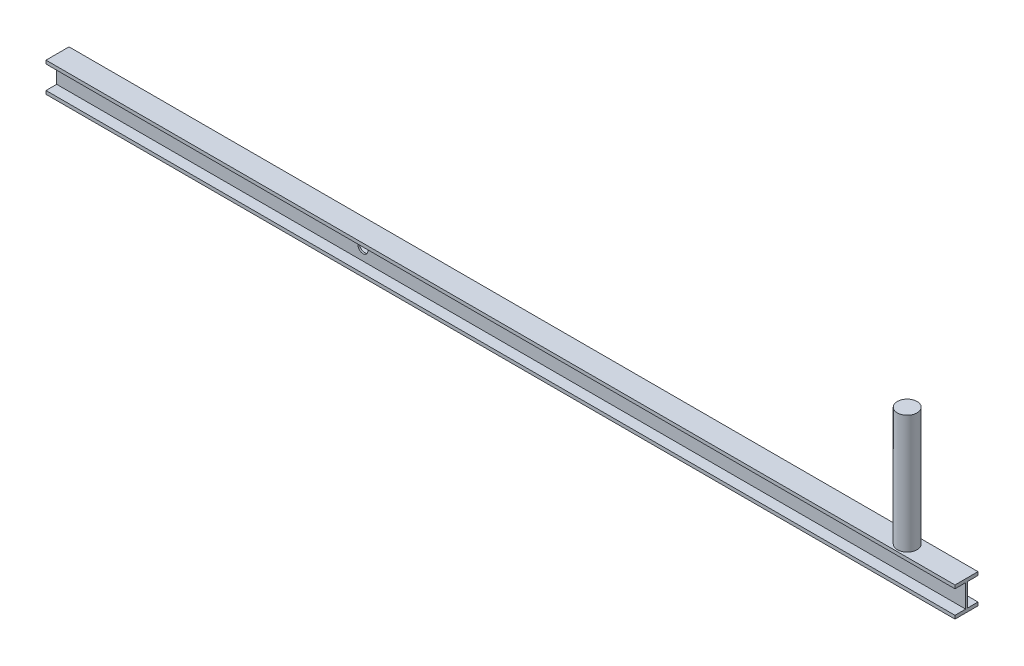
ISO-10303-21;
HEADER;
FILE_DESCRIPTION(('STEP AP214'),'2;1');
FILE_NAME('part.step','',(''),(''),'','','');
FILE_SCHEMA(('AUTOMOTIVE_DESIGN { 1 0 10303 214 1 1 1 1 }'));
ENDSEC;
DATA;
#1=APPLICATION_CONTEXT('core data for automotive mechanical design processes');
#2=APPLICATION_PROTOCOL_DEFINITION('international standard','automotive_design',2000,#1);
#3=PRODUCT_CONTEXT('',#1,'mechanical');
#4=PRODUCT('Part','Part','',(#3));
#5=PRODUCT_RELATED_PRODUCT_CATEGORY('part','',(#4));
#6=PRODUCT_DEFINITION_FORMATION('','',#4);
#7=PRODUCT_DEFINITION_CONTEXT('part definition',#1,'design');
#8=PRODUCT_DEFINITION('design','',#6,#7);
#9=PRODUCT_DEFINITION_SHAPE('','',#8);
#10=(LENGTH_UNIT() NAMED_UNIT(*) SI_UNIT(.MILLI.,.METRE.));
#11=(NAMED_UNIT(*) PLANE_ANGLE_UNIT() SI_UNIT($,.RADIAN.));
#12=(NAMED_UNIT(*) SI_UNIT($,.STERADIAN.) SOLID_ANGLE_UNIT());
#13=UNCERTAINTY_MEASURE_WITH_UNIT(LENGTH_MEASURE(1.E-05),#10,'distance_accuracy_value','');
#14=(GEOMETRIC_REPRESENTATION_CONTEXT(3) GLOBAL_UNCERTAINTY_ASSIGNED_CONTEXT((#13)) GLOBAL_UNIT_ASSIGNED_CONTEXT((#10,
#11,#12)) REPRESENTATION_CONTEXT('',''));
#15=CARTESIAN_POINT('',(0.,0.,0.));
#16=DIRECTION('',(0.,0.,1.));
#17=DIRECTION('',(1.,0.,0.));
#18=AXIS2_PLACEMENT_3D('',#15,#16,#17);
#19=CARTESIAN_POINT('',(2336.8,0.,0.));
#20=DIRECTION('',(0.,0.,-1.));
#21=DIRECTION('',(0.,1.,0.));
#22=AXIS2_PLACEMENT_3D('',#19,#20,#21);
#23=PLANE('',#22);
#24=DIRECTION('',(0.,-1.,0.));
#25=VECTOR('',#24,1.);
#26=CARTESIAN_POINT('',(0.,0.,0.));
#27=LINE('',#26,#25);
#28=CARTESIAN_POINT('',(0.,8.63599999999999,0.));
#29=VERTEX_POINT('',#28);
#30=CARTESIAN_POINT('',(0.,0.,0.));
#31=VERTEX_POINT('',#30);
#32=EDGE_CURVE('E154',#29,#31,#27,.T.);
#33=ORIENTED_EDGE('',*,*,#32,.T.);
#34=DIRECTION('',(-1.,0.,0.));
#35=VECTOR('',#34,1.);
#36=CARTESIAN_POINT('',(2336.8,0.,0.));
#37=LINE('',#36,#35);
#38=CARTESIAN_POINT('',(2336.8,0.,0.));
#39=VERTEX_POINT('',#38);
#40=EDGE_CURVE('E41',#39,#31,#37,.T.);
#41=ORIENTED_EDGE('',*,*,#40,.F.);
#42=DIRECTION('',(0.,-1.,0.));
#43=VECTOR('',#42,1.);
#44=CARTESIAN_POINT('',(2336.8,0.,0.));
#45=LINE('',#44,#43);
#46=CARTESIAN_POINT('',(2336.8,8.63599999999999,0.));
#47=VERTEX_POINT('',#46);
#48=EDGE_CURVE('E177',#47,#39,#45,.T.);
#49=ORIENTED_EDGE('',*,*,#48,.F.);
#50=DIRECTION('',(-1.,0.,0.));
#51=VECTOR('',#50,1.);
#52=CARTESIAN_POINT('',(2336.8,8.63599999999999,0.));
#53=LINE('',#52,#51);
#54=EDGE_CURVE('E150',#47,#29,#53,.T.);
#55=ORIENTED_EDGE('',*,*,#54,.T.);
#56=EDGE_LOOP('',(#33,#41,#49,#55));
#57=FACE_BOUND('',#56,.T.);
#58=ADVANCED_FACE('F32',(#57),#23,.F.);
#59=CARTESIAN_POINT('',(2336.8,0.,0.));
#60=DIRECTION('',(0.,1.,0.));
#61=DIRECTION('',(0.,0.,1.));
#62=AXIS2_PLACEMENT_3D('',#59,#60,#61);
#63=PLANE('',#62);
#64=DIRECTION('',(0.,0.,-1.));
#65=VECTOR('',#64,1.);
#66=CARTESIAN_POINT('',(0.,0.,0.));
#67=LINE('',#66,#65);
#68=CARTESIAN_POINT('',(0.,0.,-59.182));
#69=VERTEX_POINT('',#68);
#70=EDGE_CURVE('E157',#31,#69,#67,.T.);
#71=ORIENTED_EDGE('',*,*,#70,.T.);
#72=DIRECTION('',(-1.,0.,0.));
#73=VECTOR('',#72,1.);
#74=CARTESIAN_POINT('',(2336.8,0.,-59.182));
#75=LINE('',#74,#73);
#76=CARTESIAN_POINT('',(2336.8,0.,-59.182));
#77=VERTEX_POINT('',#76);
#78=EDGE_CURVE('E199',#77,#69,#75,.T.);
#79=ORIENTED_EDGE('',*,*,#78,.F.);
#80=DIRECTION('',(0.,0.,-1.));
#81=VECTOR('',#80,1.);
#82=CARTESIAN_POINT('',(2336.8,0.,0.));
#83=LINE('',#82,#81);
#84=EDGE_CURVE('E105',#39,#77,#83,.T.);
#85=ORIENTED_EDGE('',*,*,#84,.F.);
#86=ORIENTED_EDGE('',*,*,#40,.T.);
#87=EDGE_LOOP('',(#71,#79,#85,#86));
#88=FACE_BOUND('',#87,.T.);
#89=ADVANCED_FACE('F203',(#88),#63,.F.);
#90=CARTESIAN_POINT('',(2336.8,0.,-59.182));
#91=DIRECTION('',(0.,0.,1.));
#92=DIRECTION('',(0.,-1.,0.));
#93=AXIS2_PLACEMENT_3D('',#90,#91,#92);
#94=PLANE('',#93);
#95=DIRECTION('',(0.,1.,0.));
#96=VECTOR('',#95,1.);
#97=CARTESIAN_POINT('',(0.,0.,-59.182));
#98=LINE('',#97,#96);
#99=CARTESIAN_POINT('',(0.,8.636,-59.182));
#100=VERTEX_POINT('',#99);
#101=EDGE_CURVE('E160',#69,#100,#98,.T.);
#102=ORIENTED_EDGE('',*,*,#101,.T.);
#103=DIRECTION('',(-1.,0.,0.));
#104=VECTOR('',#103,1.);
#105=CARTESIAN_POINT('',(2336.8,8.636,-59.182));
#106=LINE('',#105,#104);
#107=CARTESIAN_POINT('',(2336.8,8.636,-59.182));
#108=VERTEX_POINT('',#107);
#109=EDGE_CURVE('E196',#108,#100,#106,.T.);
#110=ORIENTED_EDGE('',*,*,#109,.F.);
#111=DIRECTION('',(0.,1.,0.));
#112=VECTOR('',#111,1.);
#113=CARTESIAN_POINT('',(2336.8,0.,-59.182));
#114=LINE('',#113,#112);
#115=EDGE_CURVE('E223',#77,#108,#114,.T.);
#116=ORIENTED_EDGE('',*,*,#115,.F.);
#117=ORIENTED_EDGE('',*,*,#78,.T.);
#118=EDGE_LOOP('',(#102,#110,#116,#117));
#119=FACE_BOUND('',#118,.T.);
#120=ADVANCED_FACE('F214',(#119),#94,.F.);
#121=CARTESIAN_POINT('',(2336.8,8.636,-59.182));
#122=DIRECTION('',(0.,-1.,0.));
#123=DIRECTION('',(0.,0.,-1.));
#124=AXIS2_PLACEMENT_3D('',#121,#122,#123);
#125=PLANE('',#124);
#126=DIRECTION('',(0.,0.,1.));
#127=VECTOR('',#126,1.);
#128=CARTESIAN_POINT('',(0.,8.636,-59.182));
#129=LINE('',#128,#127);
#130=CARTESIAN_POINT('',(0.,8.636,-31.75));
#131=VERTEX_POINT('',#130);
#132=EDGE_CURVE('E162',#100,#131,#129,.T.);
#133=ORIENTED_EDGE('',*,*,#132,.T.);
#134=DIRECTION('',(-1.,0.,0.));
#135=VECTOR('',#134,1.);
#136=CARTESIAN_POINT('',(2336.8,8.636,-31.75));
#137=LINE('',#136,#135);
#138=CARTESIAN_POINT('',(2336.8,8.636,-31.75));
#139=VERTEX_POINT('',#138);
#140=EDGE_CURVE('E193',#139,#131,#137,.T.);
#141=ORIENTED_EDGE('',*,*,#140,.F.);
#142=DIRECTION('',(0.,0.,1.));
#143=VECTOR('',#142,1.);
#144=CARTESIAN_POINT('',(2336.8,8.636,-59.182));
#145=LINE('',#144,#143);
#146=EDGE_CURVE('E220',#108,#139,#145,.T.);
#147=ORIENTED_EDGE('',*,*,#146,.F.);
#148=ORIENTED_EDGE('',*,*,#109,.T.);
#149=EDGE_LOOP('',(#133,#141,#147,#148));
#150=FACE_BOUND('',#149,.T.);
#151=ADVANCED_FACE('F218',(#150),#125,.F.);
#152=CARTESIAN_POINT('',(2336.8,67.564,-31.75));
#153=DIRECTION('',(0.,0.,1.));
#154=DIRECTION('',(1.,0.,0.));
#155=AXIS2_PLACEMENT_3D('',#152,#153,#154);
#156=PLANE('',#155);
#157=CARTESIAN_POINT('',(787.4,38.1,-31.75));
#158=DIRECTION('',(0.,0.,1.));
#159=DIRECTION('',(1.,0.,0.));
#160=AXIS2_PLACEMENT_3D('',#157,#158,#159);
#161=CIRCLE('',#160,12.7);
#162=CARTESIAN_POINT('',(800.1,38.1,-31.75));
#163=VERTEX_POINT('',#162);
#164=EDGE_CURVE('E380',#163,#163,#161,.T.);
#165=ORIENTED_EDGE('',*,*,#164,.T.);
#166=EDGE_LOOP('',(#165));
#167=FACE_BOUND('',#166,.T.);
#168=DIRECTION('',(0.,1.,0.));
#169=VECTOR('',#168,1.);
#170=CARTESIAN_POINT('',(0.,67.564,-31.75));
#171=LINE('',#170,#169);
#172=CARTESIAN_POINT('',(0.,67.564,-31.75));
#173=VERTEX_POINT('',#172);
#174=EDGE_CURVE('E164',#131,#173,#171,.T.);
#175=ORIENTED_EDGE('',*,*,#174,.T.);
#176=DIRECTION('',(-1.,0.,0.));
#177=VECTOR('',#176,1.);
#178=CARTESIAN_POINT('',(2336.8,67.564,-31.75));
#179=LINE('',#178,#177);
#180=CARTESIAN_POINT('',(2336.8,67.564,-31.75));
#181=VERTEX_POINT('',#180);
#182=EDGE_CURVE('E190',#181,#173,#179,.T.);
#183=ORIENTED_EDGE('',*,*,#182,.F.);
#184=DIRECTION('',(0.,1.,0.));
#185=VECTOR('',#184,1.);
#186=CARTESIAN_POINT('',(2336.8,67.564,-31.75));
#187=LINE('',#186,#185);
#188=EDGE_CURVE('E222',#139,#181,#187,.T.);
#189=ORIENTED_EDGE('',*,*,#188,.F.);
#190=ORIENTED_EDGE('',*,*,#140,.T.);
#191=EDGE_LOOP('',(#175,#183,#189,#190));
#192=FACE_BOUND('',#191,.T.);
#193=ADVANCED_FACE('F254',(#167,#192),#156,.F.);
#194=CARTESIAN_POINT('',(2336.8,67.564,-59.182));
#195=DIRECTION('',(0.,1.,0.));
#196=DIRECTION('',(0.,0.,1.));
#197=AXIS2_PLACEMENT_3D('',#194,#195,#196);
#198=PLANE('',#197);
#199=DIRECTION('',(0.,0.,-1.));
#200=VECTOR('',#199,1.);
#201=CARTESIAN_POINT('',(0.,67.564,-59.182));
#202=LINE('',#201,#200);
#203=CARTESIAN_POINT('',(0.,67.564,-59.182));
#204=VERTEX_POINT('',#203);
#205=EDGE_CURVE('E166',#173,#204,#202,.T.);
#206=ORIENTED_EDGE('',*,*,#205,.T.);
#207=DIRECTION('',(-1.,0.,0.));
#208=VECTOR('',#207,1.);
#209=CARTESIAN_POINT('',(2336.8,67.564,-59.182));
#210=LINE('',#209,#208);
#211=CARTESIAN_POINT('',(2336.8,67.564,-59.182));
#212=VERTEX_POINT('',#211);
#213=EDGE_CURVE('E187',#212,#204,#210,.T.);
#214=ORIENTED_EDGE('',*,*,#213,.F.);
#215=DIRECTION('',(0.,0.,-1.));
#216=VECTOR('',#215,1.);
#217=CARTESIAN_POINT('',(2336.8,67.564,-59.182));
#218=LINE('',#217,#216);
#219=EDGE_CURVE('E225',#181,#212,#218,.T.);
#220=ORIENTED_EDGE('',*,*,#219,.F.);
#221=ORIENTED_EDGE('',*,*,#182,.T.);
#222=EDGE_LOOP('',(#206,#214,#220,#221));
#223=FACE_BOUND('',#222,.T.);
#224=ADVANCED_FACE('F251',(#223),#198,.F.);
#225=CARTESIAN_POINT('',(2336.8,67.564,-59.182));
#226=DIRECTION('',(0.,0.,1.));
#227=DIRECTION('',(1.,0.,0.));
#228=AXIS2_PLACEMENT_3D('',#225,#226,#227);
#229=PLANE('',#228);
#230=DIRECTION('',(0.,1.,0.));
#231=VECTOR('',#230,1.);
#232=CARTESIAN_POINT('',(0.,67.564,-59.182));
#233=LINE('',#232,#231);
#234=CARTESIAN_POINT('',(0.,76.2,-59.182));
#235=VERTEX_POINT('',#234);
#236=EDGE_CURVE('E168',#204,#235,#233,.T.);
#237=ORIENTED_EDGE('',*,*,#236,.T.);
#238=DIRECTION('',(-1.,0.,0.));
#239=VECTOR('',#238,1.);
#240=CARTESIAN_POINT('',(2336.8,76.2,-59.182));
#241=LINE('',#240,#239);
#242=CARTESIAN_POINT('',(2336.8,76.2,-59.182));
#243=VERTEX_POINT('',#242);
#244=EDGE_CURVE('E184',#243,#235,#241,.T.);
#245=ORIENTED_EDGE('',*,*,#244,.F.);
#246=DIRECTION('',(0.,1.,0.));
#247=VECTOR('',#246,1.);
#248=CARTESIAN_POINT('',(2336.8,67.564,-59.182));
#249=LINE('',#248,#247);
#250=EDGE_CURVE('E231',#212,#243,#249,.T.);
#251=ORIENTED_EDGE('',*,*,#250,.F.);
#252=ORIENTED_EDGE('',*,*,#213,.T.);
#253=EDGE_LOOP('',(#237,#245,#251,#252));
#254=FACE_BOUND('',#253,.T.);
#255=ADVANCED_FACE('F247',(#254),#229,.F.);
#256=CARTESIAN_POINT('',(2336.8,76.2,0.));
#257=DIRECTION('',(0.,-1.,0.));
#258=DIRECTION('',(0.,0.,-1.));
#259=AXIS2_PLACEMENT_3D('',#256,#257,#258);
#260=PLANE('',#259);
#261=CARTESIAN_POINT('',(2184.4,76.2,-29.591));
#262=DIRECTION('',(0.,-1.,0.));
#263=DIRECTION('',(0.,0.,-1.));
#264=AXIS2_PLACEMENT_3D('',#261,#262,#263);
#265=CIRCLE('',#264,25.3999999999998);
#266=CARTESIAN_POINT('',(2184.4,76.2,-54.9909999999998));
#267=VERTEX_POINT('',#266);
#268=EDGE_CURVE('E11',#267,#267,#265,.F.);
#269=ORIENTED_EDGE('',*,*,#268,.F.);
#270=EDGE_LOOP('',(#269));
#271=FACE_BOUND('',#270,.T.);
#272=DIRECTION('',(0.,0.,1.));
#273=VECTOR('',#272,1.);
#274=CARTESIAN_POINT('',(0.,76.2,0.));
#275=LINE('',#274,#273);
#276=CARTESIAN_POINT('',(0.,76.2,0.));
#277=VERTEX_POINT('',#276);
#278=EDGE_CURVE('E170',#235,#277,#275,.T.);
#279=ORIENTED_EDGE('',*,*,#278,.T.);
#280=DIRECTION('',(-1.,0.,0.));
#281=VECTOR('',#280,1.);
#282=CARTESIAN_POINT('',(2336.8,76.2,0.));
#283=LINE('',#282,#281);
#284=CARTESIAN_POINT('',(2336.8,76.2,0.));
#285=VERTEX_POINT('',#284);
#286=EDGE_CURVE('E181',#285,#277,#283,.T.);
#287=ORIENTED_EDGE('',*,*,#286,.F.);
#288=DIRECTION('',(0.,0.,1.));
#289=VECTOR('',#288,1.);
#290=CARTESIAN_POINT('',(2336.8,76.2,0.));
#291=LINE('',#290,#289);
#292=EDGE_CURVE('E233',#243,#285,#291,.T.);
#293=ORIENTED_EDGE('',*,*,#292,.F.);
#294=ORIENTED_EDGE('',*,*,#244,.T.);
#295=EDGE_LOOP('',(#279,#287,#293,#294));
#296=FACE_BOUND('',#295,.T.);
#297=ADVANCED_FACE('F239',(#271,#296),#260,.F.);
#298=CARTESIAN_POINT('',(2336.8,67.564,0.));
#299=DIRECTION('',(0.,0.,-1.));
#300=DIRECTION('',(0.,1.,0.));
#301=AXIS2_PLACEMENT_3D('',#298,#299,#300);
#302=PLANE('',#301);
#303=DIRECTION('',(0.,-1.,0.));
#304=VECTOR('',#303,1.);
#305=CARTESIAN_POINT('',(0.,67.564,0.));
#306=LINE('',#305,#304);
#307=CARTESIAN_POINT('',(0.,67.564,0.));
#308=VERTEX_POINT('',#307);
#309=EDGE_CURVE('E172',#277,#308,#306,.T.);
#310=ORIENTED_EDGE('',*,*,#309,.T.);
#311=DIRECTION('',(-1.,0.,0.));
#312=VECTOR('',#311,1.);
#313=CARTESIAN_POINT('',(2336.8,67.564,0.));
#314=LINE('',#313,#312);
#315=CARTESIAN_POINT('',(2336.8,67.564,0.));
#316=VERTEX_POINT('',#315);
#317=EDGE_CURVE('E145',#316,#308,#314,.T.);
#318=ORIENTED_EDGE('',*,*,#317,.F.);
#319=DIRECTION('',(0.,-1.,0.));
#320=VECTOR('',#319,1.);
#321=CARTESIAN_POINT('',(2336.8,67.564,0.));
#322=LINE('',#321,#320);
#323=EDGE_CURVE('E136',#285,#316,#322,.T.);
#324=ORIENTED_EDGE('',*,*,#323,.F.);
#325=ORIENTED_EDGE('',*,*,#286,.T.);
#326=EDGE_LOOP('',(#310,#318,#324,#325));
#327=FACE_BOUND('',#326,.T.);
#328=ADVANCED_FACE('F243',(#327),#302,.F.);
#329=CARTESIAN_POINT('',(2336.8,67.564,0.));
#330=DIRECTION('',(0.,1.,0.));
#331=DIRECTION('',(0.,0.,1.));
#332=AXIS2_PLACEMENT_3D('',#329,#330,#331);
#333=PLANE('',#332);
#334=DIRECTION('',(0.,0.,-1.));
#335=VECTOR('',#334,1.);
#336=CARTESIAN_POINT('',(0.,67.564,0.));
#337=LINE('',#336,#335);
#338=CARTESIAN_POINT('',(0.,67.564,-27.432));
#339=VERTEX_POINT('',#338);
#340=EDGE_CURVE('E144',#308,#339,#337,.T.);
#341=ORIENTED_EDGE('',*,*,#340,.T.);
#342=DIRECTION('',(-1.,0.,0.));
#343=VECTOR('',#342,1.);
#344=CARTESIAN_POINT('',(2336.8,67.564,-27.432));
#345=LINE('',#344,#343);
#346=CARTESIAN_POINT('',(2336.8,67.564,-27.432));
#347=VERTEX_POINT('',#346);
#348=EDGE_CURVE('E141',#347,#339,#345,.T.);
#349=ORIENTED_EDGE('',*,*,#348,.F.);
#350=DIRECTION('',(0.,0.,-1.));
#351=VECTOR('',#350,1.);
#352=CARTESIAN_POINT('',(2336.8,67.564,0.));
#353=LINE('',#352,#351);
#354=EDGE_CURVE('E130',#316,#347,#353,.T.);
#355=ORIENTED_EDGE('',*,*,#354,.F.);
#356=ORIENTED_EDGE('',*,*,#317,.T.);
#357=EDGE_LOOP('',(#341,#349,#355,#356));
#358=FACE_BOUND('',#357,.T.);
#359=ADVANCED_FACE('F142',(#358),#333,.F.);
#360=CARTESIAN_POINT('',(2336.8,67.564,-27.432));
#361=DIRECTION('',(0.,0.,-1.));
#362=DIRECTION('',(-1.,0.,0.));
#363=AXIS2_PLACEMENT_3D('',#360,#361,#362);
#364=PLANE('',#363);
#365=CARTESIAN_POINT('',(787.4,38.1,-27.432));
#366=DIRECTION('',(0.,0.,-1.));
#367=DIRECTION('',(-1.,0.,0.));
#368=AXIS2_PLACEMENT_3D('',#365,#366,#367);
#369=CIRCLE('',#368,12.7);
#370=CARTESIAN_POINT('',(774.7,38.1,-27.432));
#371=VERTEX_POINT('',#370);
#372=EDGE_CURVE('E35',#371,#371,#369,.F.);
#373=ORIENTED_EDGE('',*,*,#372,.F.);
#374=EDGE_LOOP('',(#373));
#375=FACE_BOUND('',#374,.T.);
#376=DIRECTION('',(0.,-1.,0.));
#377=VECTOR('',#376,1.);
#378=CARTESIAN_POINT('',(0.,67.564,-27.432));
#379=LINE('',#378,#377);
#380=CARTESIAN_POINT('',(0.,8.636,-27.432));
#381=VERTEX_POINT('',#380);
#382=EDGE_CURVE('E90',#339,#381,#379,.T.);
#383=ORIENTED_EDGE('',*,*,#382,.T.);
#384=DIRECTION('',(-1.,0.,0.));
#385=VECTOR('',#384,1.);
#386=CARTESIAN_POINT('',(2336.8,8.636,-27.432));
#387=LINE('',#386,#385);
#388=CARTESIAN_POINT('',(2336.8,8.636,-27.432));
#389=VERTEX_POINT('',#388);
#390=EDGE_CURVE('E146',#389,#381,#387,.T.);
#391=ORIENTED_EDGE('',*,*,#390,.F.);
#392=DIRECTION('',(0.,-1.,0.));
#393=VECTOR('',#392,1.);
#394=CARTESIAN_POINT('',(2336.8,67.564,-27.432));
#395=LINE('',#394,#393);
#396=EDGE_CURVE('E134',#347,#389,#395,.T.);
#397=ORIENTED_EDGE('',*,*,#396,.F.);
#398=ORIENTED_EDGE('',*,*,#348,.T.);
#399=EDGE_LOOP('',(#383,#391,#397,#398));
#400=FACE_BOUND('',#399,.T.);
#401=ADVANCED_FACE('F148',(#375,#400),#364,.F.);
#402=CARTESIAN_POINT('',(2336.8,8.63599999999999,0.));
#403=DIRECTION('',(0.,-1.,0.));
#404=DIRECTION('',(0.,0.,-1.));
#405=AXIS2_PLACEMENT_3D('',#402,#403,#404);
#406=PLANE('',#405);
#407=DIRECTION('',(0.,0.,1.));
#408=VECTOR('',#407,1.);
#409=CARTESIAN_POINT('',(0.,8.63599999999999,0.));
#410=LINE('',#409,#408);
#411=EDGE_CURVE('E96',#381,#29,#410,.T.);
#412=ORIENTED_EDGE('',*,*,#411,.T.);
#413=ORIENTED_EDGE('',*,*,#54,.F.);
#414=DIRECTION('',(0.,0.,1.));
#415=VECTOR('',#414,1.);
#416=CARTESIAN_POINT('',(2336.8,8.63599999999999,0.));
#417=LINE('',#416,#415);
#418=EDGE_CURVE('E49',#389,#47,#417,.T.);
#419=ORIENTED_EDGE('',*,*,#418,.F.);
#420=ORIENTED_EDGE('',*,*,#390,.T.);
#421=EDGE_LOOP('',(#412,#413,#419,#420));
#422=FACE_BOUND('',#421,.T.);
#423=ADVANCED_FACE('F323',(#422),#406,.F.);
#424=CARTESIAN_POINT('',(2336.8,0.,0.));
#425=DIRECTION('',(-1.,0.,0.));
#426=DIRECTION('',(0.,0.,1.));
#427=AXIS2_PLACEMENT_3D('',#424,#425,#426);
#428=PLANE('',#427);
#429=ORIENTED_EDGE('',*,*,#48,.T.);
#430=ORIENTED_EDGE('',*,*,#84,.T.);
#431=ORIENTED_EDGE('',*,*,#115,.T.);
#432=ORIENTED_EDGE('',*,*,#146,.T.);
#433=ORIENTED_EDGE('',*,*,#188,.T.);
#434=ORIENTED_EDGE('',*,*,#219,.T.);
#435=ORIENTED_EDGE('',*,*,#250,.T.);
#436=ORIENTED_EDGE('',*,*,#292,.T.);
#437=ORIENTED_EDGE('',*,*,#323,.T.);
#438=ORIENTED_EDGE('',*,*,#354,.T.);
#439=ORIENTED_EDGE('',*,*,#396,.T.);
#440=ORIENTED_EDGE('',*,*,#418,.T.);
#441=EDGE_LOOP('',(#429,#430,#431,#432,#433,#434,#435,#436,#437,#438,#439,#440));
#442=FACE_BOUND('',#441,.T.);
#443=ADVANCED_FACE('F132',(#442),#428,.F.);
#444=CARTESIAN_POINT('',(0.,0.,0.));
#445=DIRECTION('',(-1.,0.,0.));
#446=DIRECTION('',(0.,0.,1.));
#447=AXIS2_PLACEMENT_3D('',#444,#445,#446);
#448=PLANE('',#447);
#449=ORIENTED_EDGE('',*,*,#32,.F.);
#450=ORIENTED_EDGE('',*,*,#411,.F.);
#451=ORIENTED_EDGE('',*,*,#382,.F.);
#452=ORIENTED_EDGE('',*,*,#340,.F.);
#453=ORIENTED_EDGE('',*,*,#309,.F.);
#454=ORIENTED_EDGE('',*,*,#278,.F.);
#455=ORIENTED_EDGE('',*,*,#236,.F.);
#456=ORIENTED_EDGE('',*,*,#205,.F.);
#457=ORIENTED_EDGE('',*,*,#174,.F.);
#458=ORIENTED_EDGE('',*,*,#132,.F.);
#459=ORIENTED_EDGE('',*,*,#101,.F.);
#460=ORIENTED_EDGE('',*,*,#70,.F.);
#461=EDGE_LOOP('',(#449,#450,#451,#452,#453,#454,#455,#456,#457,#458,#459,#460));
#462=FACE_BOUND('',#461,.T.);
#463=ADVANCED_FACE('F208',(#462),#448,.T.);
#464=CARTESIAN_POINT('',(2184.4,381.,-29.591));
#465=DIRECTION('',(0.,-1.,0.));
#466=DIRECTION('',(0.,0.,-1.));
#467=AXIS2_PLACEMENT_3D('',#464,#465,#466);
#468=CYLINDRICAL_SURFACE('',#467,25.3999999999998);
#469=CARTESIAN_POINT('',(2184.4,381.,-29.591));
#470=DIRECTION('',(0.,1.,0.));
#471=DIRECTION('',(0.,0.,1.));
#472=AXIS2_PLACEMENT_3D('',#469,#470,#471);
#473=CIRCLE('',#472,25.3999999999998);
#474=CARTESIAN_POINT('',(2184.4,381.,-54.9909999999998));
#475=VERTEX_POINT('',#474);
#476=EDGE_CURVE('E158',#475,#475,#473,.T.);
#477=CARTESIAN_POINT('',(2184.4,381.,-54.9909999999998));
#478=CARTESIAN_POINT('',(2184.4,377.825,-54.9909999999998));
#479=CARTESIAN_POINT('',(2184.4,374.65,-54.9909999999998));
#480=CARTESIAN_POINT('',(2184.4,368.3,-54.9909999999998));
#481=CARTESIAN_POINT('',(2184.4,365.125,-54.9909999999998));
#482=CARTESIAN_POINT('',(2184.4,358.775,-54.9909999999998));
#483=CARTESIAN_POINT('',(2184.4,355.6,-54.9909999999998));
#484=CARTESIAN_POINT('',(2184.4,349.25,-54.9909999999998));
#485=CARTESIAN_POINT('',(2184.4,346.075,-54.9909999999998));
#486=CARTESIAN_POINT('',(2184.4,339.725,-54.9909999999998));
#487=CARTESIAN_POINT('',(2184.4,336.55,-54.9909999999998));
#488=CARTESIAN_POINT('',(2184.4,330.2,-54.9909999999998));
#489=CARTESIAN_POINT('',(2184.4,327.025,-54.9909999999998));
#490=CARTESIAN_POINT('',(2184.4,320.675,-54.9909999999998));
#491=CARTESIAN_POINT('',(2184.4,317.5,-54.9909999999998));
#492=CARTESIAN_POINT('',(2184.4,311.15,-54.9909999999998));
#493=CARTESIAN_POINT('',(2184.4,307.975,-54.9909999999998));
#494=CARTESIAN_POINT('',(2184.4,301.625,-54.9909999999998));
#495=CARTESIAN_POINT('',(2184.4,298.45,-54.9909999999998));
#496=CARTESIAN_POINT('',(2184.4,292.1,-54.9909999999998));
#497=CARTESIAN_POINT('',(2184.4,288.925,-54.9909999999998));
#498=CARTESIAN_POINT('',(2184.4,282.575,-54.9909999999998));
#499=CARTESIAN_POINT('',(2184.4,279.4,-54.9909999999998));
#500=CARTESIAN_POINT('',(2184.4,273.05,-54.9909999999998));
#501=CARTESIAN_POINT('',(2184.4,269.875,-54.9909999999998));
#502=CARTESIAN_POINT('',(2184.4,263.525,-54.9909999999998));
#503=CARTESIAN_POINT('',(2184.4,260.35,-54.9909999999998));
#504=CARTESIAN_POINT('',(2184.4,254.,-54.9909999999998));
#505=CARTESIAN_POINT('',(2184.4,250.825,-54.9909999999998));
#506=CARTESIAN_POINT('',(2184.4,244.475,-54.9909999999998));
#507=CARTESIAN_POINT('',(2184.4,241.3,-54.9909999999998));
#508=CARTESIAN_POINT('',(2184.4,234.95,-54.9909999999998));
#509=CARTESIAN_POINT('',(2184.4,231.775,-54.9909999999998));
#510=CARTESIAN_POINT('',(2184.4,225.425,-54.9909999999998));
#511=CARTESIAN_POINT('',(2184.4,222.25,-54.9909999999998));
#512=CARTESIAN_POINT('',(2184.4,215.9,-54.9909999999998));
#513=CARTESIAN_POINT('',(2184.4,212.725,-54.9909999999998));
#514=CARTESIAN_POINT('',(2184.4,206.375,-54.9909999999998));
#515=CARTESIAN_POINT('',(2184.4,203.2,-54.9909999999998));
#516=CARTESIAN_POINT('',(2184.4,196.85,-54.9909999999998));
#517=CARTESIAN_POINT('',(2184.4,193.675,-54.9909999999998));
#518=CARTESIAN_POINT('',(2184.4,187.325,-54.9909999999998));
#519=CARTESIAN_POINT('',(2184.4,184.15,-54.9909999999998));
#520=CARTESIAN_POINT('',(2184.4,177.8,-54.9909999999998));
#521=CARTESIAN_POINT('',(2184.4,174.625,-54.9909999999998));
#522=CARTESIAN_POINT('',(2184.4,168.275,-54.9909999999998));
#523=CARTESIAN_POINT('',(2184.4,165.1,-54.9909999999998));
#524=CARTESIAN_POINT('',(2184.4,158.75,-54.9909999999998));
#525=CARTESIAN_POINT('',(2184.4,155.575,-54.9909999999998));
#526=CARTESIAN_POINT('',(2184.4,149.225,-54.9909999999998));
#527=CARTESIAN_POINT('',(2184.4,146.05,-54.9909999999998));
#528=CARTESIAN_POINT('',(2184.4,139.7,-54.9909999999998));
#529=CARTESIAN_POINT('',(2184.4,136.525,-54.9909999999998));
#530=CARTESIAN_POINT('',(2184.4,130.175,-54.9909999999998));
#531=CARTESIAN_POINT('',(2184.4,127.,-54.9909999999998));
#532=CARTESIAN_POINT('',(2184.4,120.65,-54.9909999999998));
#533=CARTESIAN_POINT('',(2184.4,117.475,-54.9909999999998));
#534=CARTESIAN_POINT('',(2184.4,111.125,-54.9909999999998));
#535=CARTESIAN_POINT('',(2184.4,107.95,-54.9909999999998));
#536=CARTESIAN_POINT('',(2184.4,101.6,-54.9909999999998));
#537=CARTESIAN_POINT('',(2184.4,98.425,-54.9909999999998));
#538=CARTESIAN_POINT('',(2184.4,92.075,-54.9909999999998));
#539=CARTESIAN_POINT('',(2184.4,88.9,-54.9909999999998));
#540=CARTESIAN_POINT('',(2184.4,82.55,-54.9909999999998));
#541=CARTESIAN_POINT('',(2184.4,79.375,-54.9909999999998));
#542=CARTESIAN_POINT('',(2184.4,76.2,-54.9909999999998));
#543=B_SPLINE_CURVE_WITH_KNOTS('',3,(#477,#478,#479,#480,#481,#482,#483,#484,#485,#486,#487,
#488,#489,#490,#491,#492,#493,#494,#495,#496,#497,#498,#499,#500,#501,#502,#503,#504,#505,#506,
#507,#508,#509,#510,#511,#512,#513,#514,#515,#516,#517,#518,#519,#520,#521,#522,#523,#524,#525,
#526,#527,#528,#529,#530,#531,#532,#533,#534,#535,#536,#537,#538,#539,#540,#541,#542),
.UNSPECIFIED.,.F.,.F.,(4,2,2,2,2,2,2,2,2,2,2,2,2,2,2,2,2,2,2,2,2,2,2,2,2,2,2,2,2,2,2,2,4),(0.,
9.52499999999995,19.05,28.575,38.1,47.625,57.15,66.675,76.2,85.725,95.2499999999999,104.775,
114.3,123.825,133.35,142.875,152.4,161.925,171.45,180.975,190.5,200.025,209.55,219.075,228.6,
238.125,247.65,257.175,266.7,276.225,285.75,295.275,304.8),.UNSPECIFIED.);
#544=EDGE_CURVE('BSEAM343',#475,#267,#543,.T.);
#545=ORIENTED_EDGE('',*,*,#476,.F.);
#546=ORIENTED_EDGE('',*,*,#268,.T.);
#547=ORIENTED_EDGE('',*,*,#544,.T.);
#548=ORIENTED_EDGE('',*,*,#544,.F.);
#549=EDGE_LOOP('',(#545,#547,#546,#548));
#550=FACE_BOUND('',#549,.T.);
#551=ADVANCED_FACE('F343',(#550),#468,.T.);
#552=CARTESIAN_POINT('',(2184.4,381.,-29.591));
#553=DIRECTION('',(0.,1.,0.));
#554=DIRECTION('',(0.,0.,1.));
#555=AXIS2_PLACEMENT_3D('',#552,#553,#554);
#556=PLANE('',#555);
#557=ORIENTED_EDGE('',*,*,#476,.T.);
#558=EDGE_LOOP('',(#557));
#559=FACE_BOUND('',#558,.T.);
#560=ADVANCED_FACE('F349',(#559),#556,.T.);
#561=CARTESIAN_POINT('',(787.4,38.1,-15.24));
#562=DIRECTION('',(0.,0.,-1.));
#563=DIRECTION('',(-1.,0.,0.));
#564=AXIS2_PLACEMENT_3D('',#561,#562,#563);
#565=CYLINDRICAL_SURFACE('',#564,12.7);
#566=ORIENTED_EDGE('',*,*,#164,.F.);
#567=EDGE_LOOP('',(#566));
#568=FACE_BOUND('',#567,.T.);
#569=ORIENTED_EDGE('',*,*,#372,.T.);
#570=EDGE_LOOP('',(#569));
#571=FACE_BOUND('',#570,.T.);
#572=ADVANCED_FACE('F356',(#568,#571),#565,.F.);
#573=CLOSED_SHELL('',(#58,#89,#120,#151,#193,#224,#255,#297,#328,#359,#401,#423,#443,#463,#551,
#560,#572));
#574=MANIFOLD_SOLID_BREP('B2',#573);
#575=ADVANCED_BREP_SHAPE_REPRESENTATION('',(#18,#574),#14);
#576=SHAPE_DEFINITION_REPRESENTATION(#9,#575);
ENDSEC;
END-ISO-10303-21;
